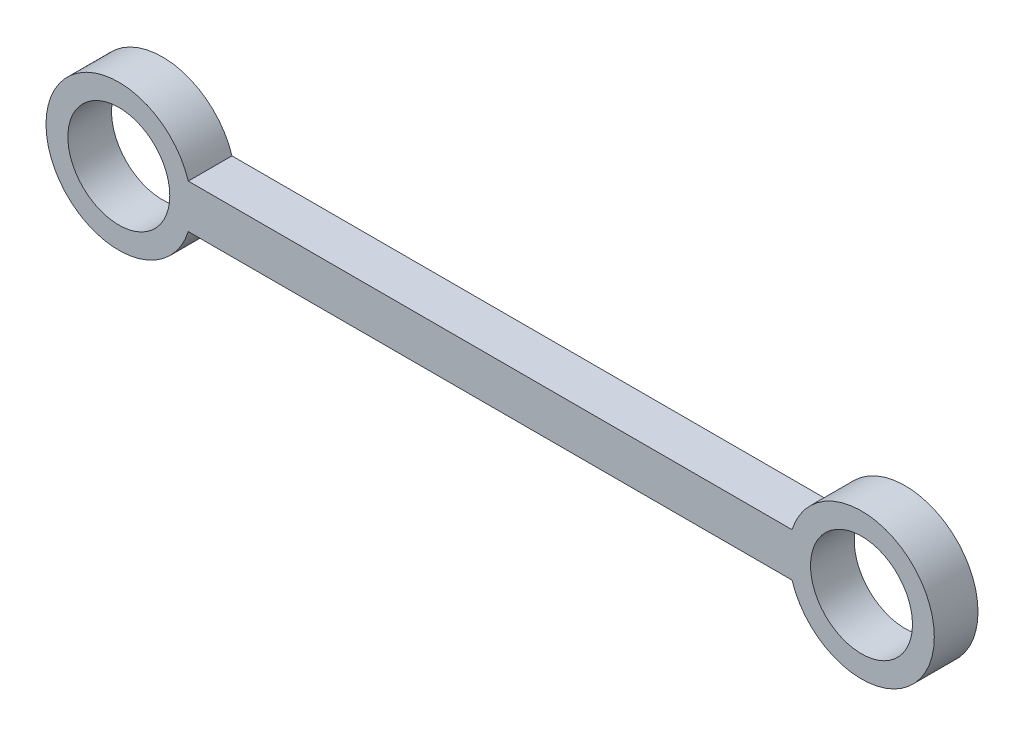
ISO-10303-21;
HEADER;
FILE_DESCRIPTION(('STEP AP214'),'2;1');
FILE_NAME('part.step','',(''),(''),'','','');
FILE_SCHEMA(('AUTOMOTIVE_DESIGN { 1 0 10303 214 1 1 1 1 }'));
ENDSEC;
DATA;
#1=APPLICATION_CONTEXT('core data for automotive mechanical design processes');
#2=APPLICATION_PROTOCOL_DEFINITION('international standard','automotive_design',2000,#1);
#3=PRODUCT_CONTEXT('',#1,'mechanical');
#4=PRODUCT('Part','Part','',(#3));
#5=PRODUCT_RELATED_PRODUCT_CATEGORY('part','',(#4));
#6=PRODUCT_DEFINITION_FORMATION('','',#4);
#7=PRODUCT_DEFINITION_CONTEXT('part definition',#1,'design');
#8=PRODUCT_DEFINITION('design','',#6,#7);
#9=PRODUCT_DEFINITION_SHAPE('','',#8);
#10=(LENGTH_UNIT() NAMED_UNIT(*) SI_UNIT(.MILLI.,.METRE.));
#11=(NAMED_UNIT(*) PLANE_ANGLE_UNIT() SI_UNIT($,.RADIAN.));
#12=(NAMED_UNIT(*) SI_UNIT($,.STERADIAN.) SOLID_ANGLE_UNIT());
#13=UNCERTAINTY_MEASURE_WITH_UNIT(LENGTH_MEASURE(1.E-05),#10,'distance_accuracy_value','');
#14=(GEOMETRIC_REPRESENTATION_CONTEXT(3) GLOBAL_UNCERTAINTY_ASSIGNED_CONTEXT((#13)) GLOBAL_UNIT_ASSIGNED_CONTEXT((#10,
#11,#12)) REPRESENTATION_CONTEXT('',''));
#15=CARTESIAN_POINT('',(0.,0.,0.));
#16=DIRECTION('',(0.,0.,1.));
#17=DIRECTION('',(1.,0.,0.));
#18=AXIS2_PLACEMENT_3D('',#15,#16,#17);
#19=CARTESIAN_POINT('',(12.75,0.,1.5));
#20=DIRECTION('',(0.,0.,1.));
#21=DIRECTION('',(1.,0.,0.));
#22=AXIS2_PLACEMENT_3D('',#19,#20,#21);
#23=PLANE('',#22);
#24=CARTESIAN_POINT('',(12.75,0.,1.5));
#25=DIRECTION('',(0.,0.,1.));
#26=DIRECTION('',(1.,0.,0.));
#27=AXIS2_PLACEMENT_3D('',#24,#25,#26);
#28=CIRCLE('',#27,1.75);
#29=CARTESIAN_POINT('',(14.5,0.,1.5));
#30=VERTEX_POINT('',#29);
#31=EDGE_CURVE('E116',#30,#30,#28,.T.);
#32=ORIENTED_EDGE('',*,*,#31,.F.);
#33=EDGE_LOOP('',(#32));
#34=FACE_BOUND('',#33,.T.);
#35=CARTESIAN_POINT('',(12.75,0.,1.5));
#36=DIRECTION('',(0.,0.,1.));
#37=DIRECTION('',(1.,0.,0.));
#38=AXIS2_PLACEMENT_3D('',#35,#36,#37);
#39=CIRCLE('',#38,2.5);
#40=CARTESIAN_POINT('',(10.3651519964576,-0.75,1.5));
#41=VERTEX_POINT('',#40);
#42=CARTESIAN_POINT('',(10.3651519964576,0.75,1.5));
#43=VERTEX_POINT('',#42);
#44=EDGE_CURVE('E96',#41,#43,#39,.T.);
#45=ORIENTED_EDGE('',*,*,#44,.T.);
#46=DIRECTION('',(-1.,0.,0.));
#47=VECTOR('',#46,1.);
#48=CARTESIAN_POINT('',(10.3651519964576,0.75,1.5));
#49=LINE('',#48,#47);
#50=CARTESIAN_POINT('',(-10.3651519964576,0.75,1.5));
#51=VERTEX_POINT('',#50);
#52=EDGE_CURVE('E91',#43,#51,#49,.T.);
#53=ORIENTED_EDGE('',*,*,#52,.T.);
#54=CARTESIAN_POINT('',(-12.75,0.,1.5));
#55=DIRECTION('',(0.,0.,1.));
#56=DIRECTION('',(1.,0.,0.));
#57=AXIS2_PLACEMENT_3D('',#54,#55,#56);
#58=CIRCLE('',#57,2.5);
#59=CARTESIAN_POINT('',(-10.3651519964576,-0.750000000000001,1.5));
#60=VERTEX_POINT('',#59);
#61=EDGE_CURVE('E94',#51,#60,#58,.T.);
#62=ORIENTED_EDGE('',*,*,#61,.T.);
#63=DIRECTION('',(1.,0.,0.));
#64=VECTOR('',#63,1.);
#65=CARTESIAN_POINT('',(10.3651519964576,-0.75,1.5));
#66=LINE('',#65,#64);
#67=EDGE_CURVE('E61',#60,#41,#66,.T.);
#68=ORIENTED_EDGE('',*,*,#67,.T.);
#69=EDGE_LOOP('',(#45,#53,#62,#68));
#70=FACE_BOUND('',#69,.T.);
#71=CARTESIAN_POINT('',(-12.75,0.,1.5));
#72=DIRECTION('',(0.,0.,1.));
#73=DIRECTION('',(1.,0.,0.));
#74=AXIS2_PLACEMENT_3D('',#71,#72,#73);
#75=CIRCLE('',#74,1.75);
#76=CARTESIAN_POINT('',(-11.,0.,1.5));
#77=VERTEX_POINT('',#76);
#78=EDGE_CURVE('E138',#77,#77,#75,.T.);
#79=ORIENTED_EDGE('',*,*,#78,.F.);
#80=EDGE_LOOP('',(#79));
#81=FACE_BOUND('',#80,.T.);
#82=ADVANCED_FACE('F43',(#34,#70,#81),#23,.T.);
#83=CARTESIAN_POINT('',(12.75,0.,0.));
#84=DIRECTION('',(0.,0.,1.));
#85=DIRECTION('',(1.,0.,0.));
#86=AXIS2_PLACEMENT_3D('',#83,#84,#85);
#87=PLANE('',#86);
#88=CARTESIAN_POINT('',(12.75,0.,0.));
#89=DIRECTION('',(0.,0.,1.));
#90=DIRECTION('',(1.,0.,0.));
#91=AXIS2_PLACEMENT_3D('',#88,#89,#90);
#92=CIRCLE('',#91,2.5);
#93=CARTESIAN_POINT('',(10.3651519964576,-0.75,0.));
#94=VERTEX_POINT('',#93);
#95=CARTESIAN_POINT('',(10.3651519964576,0.75,0.));
#96=VERTEX_POINT('',#95);
#97=EDGE_CURVE('E112',#94,#96,#92,.T.);
#98=ORIENTED_EDGE('',*,*,#97,.F.);
#99=DIRECTION('',(1.,0.,0.));
#100=VECTOR('',#99,1.);
#101=CARTESIAN_POINT('',(10.3651519964576,-0.75,0.));
#102=LINE('',#101,#100);
#103=CARTESIAN_POINT('',(-10.3651519964576,-0.750000000000001,0.));
#104=VERTEX_POINT('',#103);
#105=EDGE_CURVE('E84',#104,#94,#102,.T.);
#106=ORIENTED_EDGE('',*,*,#105,.F.);
#107=CARTESIAN_POINT('',(-12.75,0.,0.));
#108=DIRECTION('',(0.,0.,1.));
#109=DIRECTION('',(1.,0.,0.));
#110=AXIS2_PLACEMENT_3D('',#107,#108,#109);
#111=CIRCLE('',#110,2.5);
#112=CARTESIAN_POINT('',(-10.3651519964576,0.75,0.));
#113=VERTEX_POINT('',#112);
#114=EDGE_CURVE('E78',#113,#104,#111,.T.);
#115=ORIENTED_EDGE('',*,*,#114,.F.);
#116=DIRECTION('',(-1.,0.,0.));
#117=VECTOR('',#116,1.);
#118=CARTESIAN_POINT('',(10.3651519964576,0.75,0.));
#119=LINE('',#118,#117);
#120=EDGE_CURVE('E101',#96,#113,#119,.T.);
#121=ORIENTED_EDGE('',*,*,#120,.F.);
#122=EDGE_LOOP('',(#98,#106,#115,#121));
#123=FACE_BOUND('',#122,.T.);
#124=CARTESIAN_POINT('',(12.75,0.,0.));
#125=DIRECTION('',(0.,0.,1.));
#126=DIRECTION('',(1.,0.,0.));
#127=AXIS2_PLACEMENT_3D('',#124,#125,#126);
#128=CIRCLE('',#127,1.75);
#129=CARTESIAN_POINT('',(14.5,0.,0.));
#130=VERTEX_POINT('',#129);
#131=EDGE_CURVE('E134',#130,#130,#128,.T.);
#132=ORIENTED_EDGE('',*,*,#131,.T.);
#133=EDGE_LOOP('',(#132));
#134=FACE_BOUND('',#133,.T.);
#135=CARTESIAN_POINT('',(-12.75,0.,0.));
#136=DIRECTION('',(0.,0.,1.));
#137=DIRECTION('',(1.,0.,0.));
#138=AXIS2_PLACEMENT_3D('',#135,#136,#137);
#139=CIRCLE('',#138,1.75);
#140=CARTESIAN_POINT('',(-11.,0.,0.));
#141=VERTEX_POINT('',#140);
#142=EDGE_CURVE('E142',#141,#141,#139,.T.);
#143=ORIENTED_EDGE('',*,*,#142,.T.);
#144=EDGE_LOOP('',(#143));
#145=FACE_BOUND('',#144,.T.);
#146=ADVANCED_FACE('F129',(#123,#134,#145),#87,.F.);
#147=CARTESIAN_POINT('',(12.75,0.,1.5));
#148=DIRECTION('',(0.,0.,-1.));
#149=DIRECTION('',(-1.,0.,0.));
#150=AXIS2_PLACEMENT_3D('',#147,#148,#149);
#151=CYLINDRICAL_SURFACE('',#150,2.5);
#152=ORIENTED_EDGE('',*,*,#97,.T.);
#153=DIRECTION('',(0.,0.,-1.));
#154=VECTOR('',#153,1.);
#155=CARTESIAN_POINT('',(10.3651519964576,0.75,1.5));
#156=LINE('',#155,#154);
#157=EDGE_CURVE('E11',#43,#96,#156,.T.);
#158=ORIENTED_EDGE('',*,*,#157,.F.);
#159=ORIENTED_EDGE('',*,*,#44,.F.);
#160=DIRECTION('',(0.,0.,-1.));
#161=VECTOR('',#160,1.);
#162=CARTESIAN_POINT('',(10.3651519964576,-0.75,1.5));
#163=LINE('',#162,#161);
#164=EDGE_CURVE('E108',#41,#94,#163,.T.);
#165=ORIENTED_EDGE('',*,*,#164,.T.);
#166=EDGE_LOOP('',(#152,#158,#159,#165));
#167=FACE_BOUND('',#166,.T.);
#168=ADVANCED_FACE('F45',(#167),#151,.T.);
#169=CARTESIAN_POINT('',(10.3651519964576,0.75,1.5));
#170=DIRECTION('',(0.,-1.,0.));
#171=DIRECTION('',(0.,0.,-1.));
#172=AXIS2_PLACEMENT_3D('',#169,#170,#171);
#173=PLANE('',#172);
#174=ORIENTED_EDGE('',*,*,#120,.T.);
#175=DIRECTION('',(0.,0.,-1.));
#176=VECTOR('',#175,1.);
#177=CARTESIAN_POINT('',(-10.3651519964576,0.75,1.5));
#178=LINE('',#177,#176);
#179=EDGE_CURVE('E53',#51,#113,#178,.T.);
#180=ORIENTED_EDGE('',*,*,#179,.F.);
#181=ORIENTED_EDGE('',*,*,#52,.F.);
#182=ORIENTED_EDGE('',*,*,#157,.T.);
#183=EDGE_LOOP('',(#174,#180,#181,#182));
#184=FACE_BOUND('',#183,.T.);
#185=ADVANCED_FACE('F100',(#184),#173,.F.);
#186=CARTESIAN_POINT('',(-12.75,0.,1.5));
#187=DIRECTION('',(0.,0.,-1.));
#188=DIRECTION('',(-1.,0.,0.));
#189=AXIS2_PLACEMENT_3D('',#186,#187,#188);
#190=CYLINDRICAL_SURFACE('',#189,2.5);
#191=ORIENTED_EDGE('',*,*,#114,.T.);
#192=DIRECTION('',(0.,0.,-1.));
#193=VECTOR('',#192,1.);
#194=CARTESIAN_POINT('',(-10.3651519964576,-0.750000000000001,1.5));
#195=LINE('',#194,#193);
#196=EDGE_CURVE('E103',#60,#104,#195,.T.);
#197=ORIENTED_EDGE('',*,*,#196,.F.);
#198=ORIENTED_EDGE('',*,*,#61,.F.);
#199=ORIENTED_EDGE('',*,*,#179,.T.);
#200=EDGE_LOOP('',(#191,#197,#198,#199));
#201=FACE_BOUND('',#200,.T.);
#202=ADVANCED_FACE('F104',(#201),#190,.T.);
#203=CARTESIAN_POINT('',(10.3651519964576,-0.75,1.5));
#204=DIRECTION('',(0.,1.,0.));
#205=DIRECTION('',(0.,0.,1.));
#206=AXIS2_PLACEMENT_3D('',#203,#204,#205);
#207=PLANE('',#206);
#208=ORIENTED_EDGE('',*,*,#105,.T.);
#209=ORIENTED_EDGE('',*,*,#164,.F.);
#210=ORIENTED_EDGE('',*,*,#67,.F.);
#211=ORIENTED_EDGE('',*,*,#196,.T.);
#212=EDGE_LOOP('',(#208,#209,#210,#211));
#213=FACE_BOUND('',#212,.T.);
#214=ADVANCED_FACE('F126',(#213),#207,.F.);
#215=CARTESIAN_POINT('',(12.75,0.,1.5));
#216=DIRECTION('',(0.,0.,-1.));
#217=DIRECTION('',(-1.,0.,0.));
#218=AXIS2_PLACEMENT_3D('',#215,#216,#217);
#219=CYLINDRICAL_SURFACE('',#218,1.75);
#220=ORIENTED_EDGE('',*,*,#31,.T.);
#221=EDGE_LOOP('',(#220));
#222=FACE_BOUND('',#221,.T.);
#223=ORIENTED_EDGE('',*,*,#131,.F.);
#224=EDGE_LOOP('',(#223));
#225=FACE_BOUND('',#224,.T.);
#226=ADVANCED_FACE('F161',(#222,#225),#219,.F.);
#227=CARTESIAN_POINT('',(-12.75,0.,1.5));
#228=DIRECTION('',(0.,0.,-1.));
#229=DIRECTION('',(-1.,0.,0.));
#230=AXIS2_PLACEMENT_3D('',#227,#228,#229);
#231=CYLINDRICAL_SURFACE('',#230,1.75);
#232=ORIENTED_EDGE('',*,*,#78,.T.);
#233=EDGE_LOOP('',(#232));
#234=FACE_BOUND('',#233,.T.);
#235=ORIENTED_EDGE('',*,*,#142,.F.);
#236=EDGE_LOOP('',(#235));
#237=FACE_BOUND('',#236,.T.);
#238=ADVANCED_FACE('F150',(#234,#237),#231,.F.);
#239=CLOSED_SHELL('',(#82,#146,#168,#185,#202,#214,#226,#238));
#240=MANIFOLD_SOLID_BREP('B2',#239);
#241=ADVANCED_BREP_SHAPE_REPRESENTATION('',(#18,#240),#14);
#242=SHAPE_DEFINITION_REPRESENTATION(#9,#241);
ENDSEC;
END-ISO-10303-21;
